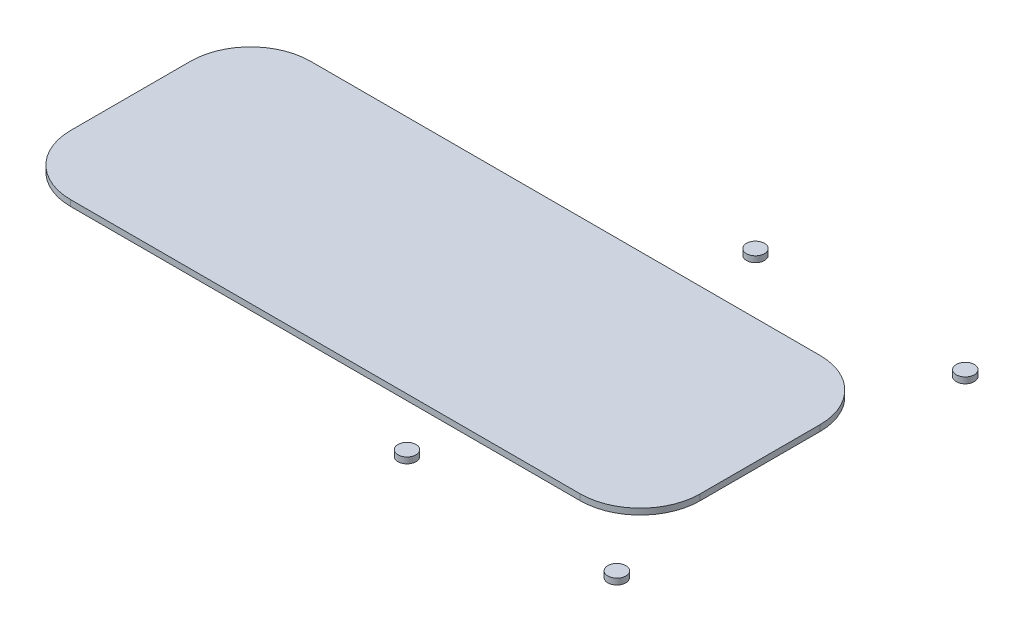
ISO-10303-21;
HEADER;
FILE_DESCRIPTION(('STEP AP214'),'2;1');
FILE_NAME('part.step','',(''),(''),'','','');
FILE_SCHEMA(('AUTOMOTIVE_DESIGN { 1 0 10303 214 1 1 1 1 }'));
ENDSEC;
DATA;
#1=APPLICATION_CONTEXT('core data for automotive mechanical design processes');
#2=APPLICATION_PROTOCOL_DEFINITION('international standard','automotive_design',2000,#1);
#3=PRODUCT_CONTEXT('',#1,'mechanical');
#4=PRODUCT('Part','Part','',(#3));
#5=PRODUCT_RELATED_PRODUCT_CATEGORY('part','',(#4));
#6=PRODUCT_DEFINITION_FORMATION('','',#4);
#7=PRODUCT_DEFINITION_CONTEXT('part definition',#1,'design');
#8=PRODUCT_DEFINITION('design','',#6,#7);
#9=PRODUCT_DEFINITION_SHAPE('','',#8);
#10=(LENGTH_UNIT() NAMED_UNIT(*) SI_UNIT(.MILLI.,.METRE.));
#11=(NAMED_UNIT(*) PLANE_ANGLE_UNIT() SI_UNIT($,.RADIAN.));
#12=(NAMED_UNIT(*) SI_UNIT($,.STERADIAN.) SOLID_ANGLE_UNIT());
#13=UNCERTAINTY_MEASURE_WITH_UNIT(LENGTH_MEASURE(1.E-05),#10,'distance_accuracy_value','');
#14=(GEOMETRIC_REPRESENTATION_CONTEXT(3) GLOBAL_UNCERTAINTY_ASSIGNED_CONTEXT((#13)) GLOBAL_UNIT_ASSIGNED_CONTEXT((#10,
#11,#12)) REPRESENTATION_CONTEXT('',''));
#15=CARTESIAN_POINT('',(0.,0.,0.));
#16=DIRECTION('',(0.,0.,1.));
#17=DIRECTION('',(1.,0.,0.));
#18=AXIS2_PLACEMENT_3D('',#15,#16,#17);
#19=CARTESIAN_POINT('',(190.917305236703,5.08,23.01875));
#20=DIRECTION('',(0.,-1.,0.));
#21=DIRECTION('',(0.,0.,-1.));
#22=AXIS2_PLACEMENT_3D('',#19,#20,#21);
#23=CYLINDRICAL_SURFACE('',#22,3.81000000000001);
#24=CARTESIAN_POINT('',(190.917305236703,5.08,23.01875));
#25=DIRECTION('',(0.,1.,0.));
#26=DIRECTION('',(0.,0.,1.));
#27=AXIS2_PLACEMENT_3D('',#24,#25,#26);
#28=CIRCLE('',#27,3.81000000000001);
#29=CARTESIAN_POINT('',(190.917305236703,5.08,26.82875));
#30=VERTEX_POINT('',#29);
#31=EDGE_CURVE('E11',#30,#30,#28,.T.);
#32=ORIENTED_EDGE('',*,*,#31,.F.);
#33=EDGE_LOOP('',(#32));
#34=FACE_BOUND('',#33,.T.);
#35=CARTESIAN_POINT('',(190.917305236703,2.54,23.01875));
#36=DIRECTION('',(0.,1.,0.));
#37=DIRECTION('',(0.,0.,1.));
#38=AXIS2_PLACEMENT_3D('',#35,#36,#37);
#39=CIRCLE('',#38,3.81000000000001);
#40=CARTESIAN_POINT('',(190.917305236703,2.54,26.82875));
#41=VERTEX_POINT('',#40);
#42=EDGE_CURVE('E42',#41,#41,#39,.T.);
#43=ORIENTED_EDGE('',*,*,#42,.T.);
#44=EDGE_LOOP('',(#43));
#45=FACE_BOUND('',#44,.T.);
#46=ADVANCED_FACE('F39',(#34,#45),#23,.T.);
#47=CARTESIAN_POINT('',(190.917305236703,5.08,23.01875));
#48=DIRECTION('',(0.,1.,0.));
#49=DIRECTION('',(0.,0.,1.));
#50=AXIS2_PLACEMENT_3D('',#47,#48,#49);
#51=PLANE('',#50);
#52=ORIENTED_EDGE('',*,*,#31,.T.);
#53=EDGE_LOOP('',(#52));
#54=FACE_BOUND('',#53,.T.);
#55=ADVANCED_FACE('F54',(#54),#51,.T.);
#56=CARTESIAN_POINT('',(190.917305236703,2.54,23.01875));
#57=DIRECTION('',(0.,1.,0.));
#58=DIRECTION('',(0.,0.,1.));
#59=AXIS2_PLACEMENT_3D('',#56,#57,#58);
#60=PLANE('',#59);
#61=ORIENTED_EDGE('',*,*,#42,.F.);
#62=EDGE_LOOP('',(#61));
#63=FACE_BOUND('',#62,.T.);
#64=ADVANCED_FACE('F52',(#63),#60,.F.);
#65=CLOSED_SHELL('',(#46,#55,#64));
#66=MANIFOLD_SOLID_BREP('B2',#65);
#67=CARTESIAN_POINT('',(279.817305236703,5.08,23.01875));
#68=DIRECTION('',(0.,-1.,0.));
#69=DIRECTION('',(0.,0.,-1.));
#70=AXIS2_PLACEMENT_3D('',#67,#68,#69);
#71=CYLINDRICAL_SURFACE('',#70,3.80999999999999);
#72=CARTESIAN_POINT('',(279.817305236703,5.08,23.01875));
#73=DIRECTION('',(0.,1.,0.));
#74=DIRECTION('',(0.,0.,1.));
#75=AXIS2_PLACEMENT_3D('',#72,#73,#74);
#76=CIRCLE('',#75,3.80999999999999);
#77=CARTESIAN_POINT('',(279.817305236703,5.08,26.82875));
#78=VERTEX_POINT('',#77);
#79=EDGE_CURVE('E38',#78,#78,#76,.T.);
#80=ORIENTED_EDGE('',*,*,#79,.F.);
#81=EDGE_LOOP('',(#80));
#82=FACE_BOUND('',#81,.T.);
#83=CARTESIAN_POINT('',(279.817305236703,2.54,23.01875));
#84=DIRECTION('',(0.,1.,0.));
#85=DIRECTION('',(0.,0.,1.));
#86=AXIS2_PLACEMENT_3D('',#83,#84,#85);
#87=CIRCLE('',#86,3.80999999999999);
#88=CARTESIAN_POINT('',(279.817305236703,2.54,26.82875));
#89=VERTEX_POINT('',#88);
#90=EDGE_CURVE('E90',#89,#89,#87,.T.);
#91=ORIENTED_EDGE('',*,*,#90,.T.);
#92=EDGE_LOOP('',(#91));
#93=FACE_BOUND('',#92,.T.);
#94=ADVANCED_FACE('F87',(#82,#93),#71,.T.);
#95=CARTESIAN_POINT('',(279.817305236703,5.08,23.01875));
#96=DIRECTION('',(0.,1.,0.));
#97=DIRECTION('',(0.,0.,1.));
#98=AXIS2_PLACEMENT_3D('',#95,#96,#97);
#99=PLANE('',#98);
#100=ORIENTED_EDGE('',*,*,#79,.T.);
#101=EDGE_LOOP('',(#100));
#102=FACE_BOUND('',#101,.T.);
#103=ADVANCED_FACE('F102',(#102),#99,.T.);
#104=CARTESIAN_POINT('',(279.817305236703,2.54,23.01875));
#105=DIRECTION('',(0.,1.,0.));
#106=DIRECTION('',(0.,0.,1.));
#107=AXIS2_PLACEMENT_3D('',#104,#105,#106);
#108=PLANE('',#107);
#109=ORIENTED_EDGE('',*,*,#90,.F.);
#110=EDGE_LOOP('',(#109));
#111=FACE_BOUND('',#110,.T.);
#112=ADVANCED_FACE('F100',(#111),#108,.F.);
#113=CLOSED_SHELL('',(#94,#103,#112));
#114=MANIFOLD_SOLID_BREP('B6',#113);
#115=CARTESIAN_POINT('',(279.817305236703,5.08,-124.61875));
#116=DIRECTION('',(0.,-1.,0.));
#117=DIRECTION('',(0.,0.,-1.));
#118=AXIS2_PLACEMENT_3D('',#115,#116,#117);
#119=CYLINDRICAL_SURFACE('',#118,3.80999999999998);
#120=CARTESIAN_POINT('',(279.817305236703,5.08,-124.61875));
#121=DIRECTION('',(0.,1.,0.));
#122=DIRECTION('',(0.,0.,1.));
#123=AXIS2_PLACEMENT_3D('',#120,#121,#122);
#124=CIRCLE('',#123,3.80999999999998);
#125=CARTESIAN_POINT('',(279.817305236703,5.08,-120.80875));
#126=VERTEX_POINT('',#125);
#127=EDGE_CURVE('E86',#126,#126,#124,.T.);
#128=ORIENTED_EDGE('',*,*,#127,.F.);
#129=EDGE_LOOP('',(#128));
#130=FACE_BOUND('',#129,.T.);
#131=CARTESIAN_POINT('',(279.817305236703,2.54,-124.61875));
#132=DIRECTION('',(0.,1.,0.));
#133=DIRECTION('',(0.,0.,1.));
#134=AXIS2_PLACEMENT_3D('',#131,#132,#133);
#135=CIRCLE('',#134,3.80999999999998);
#136=CARTESIAN_POINT('',(279.817305236703,2.54,-120.80875));
#137=VERTEX_POINT('',#136);
#138=EDGE_CURVE('E138',#137,#137,#135,.T.);
#139=ORIENTED_EDGE('',*,*,#138,.T.);
#140=EDGE_LOOP('',(#139));
#141=FACE_BOUND('',#140,.T.);
#142=ADVANCED_FACE('F135',(#130,#141),#119,.T.);
#143=CARTESIAN_POINT('',(279.817305236703,5.08,-124.61875));
#144=DIRECTION('',(0.,1.,0.));
#145=DIRECTION('',(0.,0.,1.));
#146=AXIS2_PLACEMENT_3D('',#143,#144,#145);
#147=PLANE('',#146);
#148=ORIENTED_EDGE('',*,*,#127,.T.);
#149=EDGE_LOOP('',(#148));
#150=FACE_BOUND('',#149,.T.);
#151=ADVANCED_FACE('F150',(#150),#147,.T.);
#152=CARTESIAN_POINT('',(279.817305236703,2.54,-124.61875));
#153=DIRECTION('',(0.,1.,0.));
#154=DIRECTION('',(0.,0.,1.));
#155=AXIS2_PLACEMENT_3D('',#152,#153,#154);
#156=PLANE('',#155);
#157=ORIENTED_EDGE('',*,*,#138,.F.);
#158=EDGE_LOOP('',(#157));
#159=FACE_BOUND('',#158,.T.);
#160=ADVANCED_FACE('F148',(#159),#156,.F.);
#161=CLOSED_SHELL('',(#142,#151,#160));
#162=MANIFOLD_SOLID_BREP('B33',#161);
#163=CARTESIAN_POINT('',(190.917305236703,5.08,-124.61875));
#164=DIRECTION('',(0.,-1.,0.));
#165=DIRECTION('',(0.,0.,-1.));
#166=AXIS2_PLACEMENT_3D('',#163,#164,#165);
#167=CYLINDRICAL_SURFACE('',#166,3.81000000000002);
#168=CARTESIAN_POINT('',(190.917305236703,5.08,-124.61875));
#169=DIRECTION('',(0.,1.,0.));
#170=DIRECTION('',(0.,0.,1.));
#171=AXIS2_PLACEMENT_3D('',#168,#169,#170);
#172=CIRCLE('',#171,3.81000000000002);
#173=CARTESIAN_POINT('',(190.917305236703,5.08,-120.80875));
#174=VERTEX_POINT('',#173);
#175=EDGE_CURVE('E134',#174,#174,#172,.T.);
#176=ORIENTED_EDGE('',*,*,#175,.F.);
#177=EDGE_LOOP('',(#176));
#178=FACE_BOUND('',#177,.T.);
#179=CARTESIAN_POINT('',(190.917305236703,2.54,-124.61875));
#180=DIRECTION('',(0.,1.,0.));
#181=DIRECTION('',(0.,0.,1.));
#182=AXIS2_PLACEMENT_3D('',#179,#180,#181);
#183=CIRCLE('',#182,3.81000000000002);
#184=CARTESIAN_POINT('',(190.917305236703,2.54,-120.80875));
#185=VERTEX_POINT('',#184);
#186=EDGE_CURVE('E187',#185,#185,#183,.T.);
#187=ORIENTED_EDGE('',*,*,#186,.T.);
#188=EDGE_LOOP('',(#187));
#189=FACE_BOUND('',#188,.T.);
#190=ADVANCED_FACE('F184',(#178,#189),#167,.T.);
#191=CARTESIAN_POINT('',(190.917305236703,5.08,-124.61875));
#192=DIRECTION('',(0.,1.,0.));
#193=DIRECTION('',(0.,0.,1.));
#194=AXIS2_PLACEMENT_3D('',#191,#192,#193);
#195=PLANE('',#194);
#196=ORIENTED_EDGE('',*,*,#175,.T.);
#197=EDGE_LOOP('',(#196));
#198=FACE_BOUND('',#197,.T.);
#199=ADVANCED_FACE('F199',(#198),#195,.T.);
#200=CARTESIAN_POINT('',(190.917305236703,2.54,-124.61875));
#201=DIRECTION('',(0.,1.,0.));
#202=DIRECTION('',(0.,0.,1.));
#203=AXIS2_PLACEMENT_3D('',#200,#201,#202);
#204=PLANE('',#203);
#205=ORIENTED_EDGE('',*,*,#186,.F.);
#206=EDGE_LOOP('',(#205));
#207=FACE_BOUND('',#206,.T.);
#208=ADVANCED_FACE('F197',(#207),#204,.F.);
#209=CLOSED_SHELL('',(#190,#199,#208));
#210=MANIFOLD_SOLID_BREP('B81',#209);
#211=CARTESIAN_POINT('',(0.,2.54,0.));
#212=DIRECTION('',(1.,0.,0.));
#213=DIRECTION('',(0.,0.,-1.));
#214=AXIS2_PLACEMENT_3D('',#211,#212,#213);
#215=PLANE('',#214);
#216=DIRECTION('',(0.,0.,1.));
#217=VECTOR('',#216,1.);
#218=CARTESIAN_POINT('',(0.,2.54,0.));
#219=LINE('',#218,#217);
#220=CARTESIAN_POINT('',(0.,2.54,-76.2));
#221=VERTEX_POINT('',#220);
#222=CARTESIAN_POINT('',(0.,2.54,-25.4));
#223=VERTEX_POINT('',#222);
#224=EDGE_CURVE('E310',#221,#223,#219,.T.);
#225=ORIENTED_EDGE('',*,*,#224,.F.);
#226=DIRECTION('',(0.,-1.,0.));
#227=VECTOR('',#226,1.);
#228=CARTESIAN_POINT('',(0.,2.54,-76.2));
#229=LINE('',#228,#227);
#230=CARTESIAN_POINT('',(0.,0.,-76.2));
#231=VERTEX_POINT('',#230);
#232=EDGE_CURVE('E295',#221,#231,#229,.T.);
#233=ORIENTED_EDGE('',*,*,#232,.T.);
#234=DIRECTION('',(0.,0.,1.));
#235=VECTOR('',#234,1.);
#236=CARTESIAN_POINT('',(0.,0.,0.));
#237=LINE('',#236,#235);
#238=CARTESIAN_POINT('',(0.,0.,-25.4));
#239=VERTEX_POINT('',#238);
#240=EDGE_CURVE('E307',#231,#239,#237,.T.);
#241=ORIENTED_EDGE('',*,*,#240,.T.);
#242=DIRECTION('',(0.,-1.,0.));
#243=VECTOR('',#242,1.);
#244=CARTESIAN_POINT('',(0.,2.54,-25.4));
#245=LINE('',#244,#243);
#246=EDGE_CURVE('E312',#239,#223,#245,.F.);
#247=ORIENTED_EDGE('',*,*,#246,.T.);
#248=EDGE_LOOP('',(#225,#233,#241,#247));
#249=FACE_BOUND('',#248,.T.);
#250=ADVANCED_FACE('F225',(#249),#215,.F.);
#251=CARTESIAN_POINT('',(0.,2.54,0.));
#252=DIRECTION('',(0.,0.,-1.));
#253=DIRECTION('',(-1.,0.,0.));
#254=AXIS2_PLACEMENT_3D('',#251,#252,#253);
#255=PLANE('',#254);
#256=DIRECTION('',(1.,0.,0.));
#257=VECTOR('',#256,1.);
#258=CARTESIAN_POINT('',(0.,2.54,0.));
#259=LINE('',#258,#257);
#260=CARTESIAN_POINT('',(25.4,2.54,0.));
#261=VERTEX_POINT('',#260);
#262=CARTESIAN_POINT('',(241.3,2.54,0.));
#263=VERTEX_POINT('',#262);
#264=EDGE_CURVE('E352',#261,#263,#259,.T.);
#265=ORIENTED_EDGE('',*,*,#264,.F.);
#266=DIRECTION('',(0.,-1.,0.));
#267=VECTOR('',#266,1.);
#268=CARTESIAN_POINT('',(25.4,2.54,0.));
#269=LINE('',#268,#267);
#270=CARTESIAN_POINT('',(25.4,0.,0.));
#271=VERTEX_POINT('',#270);
#272=EDGE_CURVE('E345',#261,#271,#269,.T.);
#273=ORIENTED_EDGE('',*,*,#272,.T.);
#274=DIRECTION('',(1.,0.,0.));
#275=VECTOR('',#274,1.);
#276=CARTESIAN_POINT('',(0.,0.,0.));
#277=LINE('',#276,#275);
#278=CARTESIAN_POINT('',(241.3,0.,0.));
#279=VERTEX_POINT('',#278);
#280=EDGE_CURVE('E316',#271,#279,#277,.T.);
#281=ORIENTED_EDGE('',*,*,#280,.T.);
#282=DIRECTION('',(0.,-1.,0.));
#283=VECTOR('',#282,1.);
#284=CARTESIAN_POINT('',(241.3,2.54,0.));
#285=LINE('',#284,#283);
#286=EDGE_CURVE('E343',#279,#263,#285,.F.);
#287=ORIENTED_EDGE('',*,*,#286,.T.);
#288=EDGE_LOOP('',(#265,#273,#281,#287));
#289=FACE_BOUND('',#288,.T.);
#290=ADVANCED_FACE('F350',(#289),#255,.F.);
#291=CARTESIAN_POINT('',(266.7,2.54,0.));
#292=DIRECTION('',(-1.,0.,0.));
#293=DIRECTION('',(0.,0.,1.));
#294=AXIS2_PLACEMENT_3D('',#291,#292,#293);
#295=PLANE('',#294);
#296=DIRECTION('',(0.,0.,-1.));
#297=VECTOR('',#296,1.);
#298=CARTESIAN_POINT('',(266.7,2.54,0.));
#299=LINE('',#298,#297);
#300=CARTESIAN_POINT('',(266.7,2.54,-25.4));
#301=VERTEX_POINT('',#300);
#302=CARTESIAN_POINT('',(266.7,2.54,-76.2));
#303=VERTEX_POINT('',#302);
#304=EDGE_CURVE('E360',#301,#303,#299,.T.);
#305=ORIENTED_EDGE('',*,*,#304,.F.);
#306=DIRECTION('',(0.,-1.,0.));
#307=VECTOR('',#306,1.);
#308=CARTESIAN_POINT('',(266.7,2.54,-25.4));
#309=LINE('',#308,#307);
#310=CARTESIAN_POINT('',(266.7,0.,-25.4));
#311=VERTEX_POINT('',#310);
#312=EDGE_CURVE('E182',#301,#311,#309,.T.);
#313=ORIENTED_EDGE('',*,*,#312,.T.);
#314=DIRECTION('',(0.,0.,-1.));
#315=VECTOR('',#314,1.);
#316=CARTESIAN_POINT('',(266.7,0.,0.));
#317=LINE('',#316,#315);
#318=CARTESIAN_POINT('',(266.7,0.,-76.2));
#319=VERTEX_POINT('',#318);
#320=EDGE_CURVE('E319',#311,#319,#317,.T.);
#321=ORIENTED_EDGE('',*,*,#320,.T.);
#322=DIRECTION('',(0.,-1.,0.));
#323=VECTOR('',#322,1.);
#324=CARTESIAN_POINT('',(266.7,2.54,-76.2));
#325=LINE('',#324,#323);
#326=EDGE_CURVE('E233',#319,#303,#325,.F.);
#327=ORIENTED_EDGE('',*,*,#326,.T.);
#328=EDGE_LOOP('',(#305,#313,#321,#327));
#329=FACE_BOUND('',#328,.T.);
#330=ADVANCED_FACE('F359',(#329),#295,.F.);
#331=CARTESIAN_POINT('',(0.,2.54,-101.6));
#332=DIRECTION('',(0.,0.,1.));
#333=DIRECTION('',(1.,0.,0.));
#334=AXIS2_PLACEMENT_3D('',#331,#332,#333);
#335=PLANE('',#334);
#336=DIRECTION('',(-1.,0.,0.));
#337=VECTOR('',#336,1.);
#338=CARTESIAN_POINT('',(0.,0.,-101.6));
#339=LINE('',#338,#337);
#340=CARTESIAN_POINT('',(241.3,0.,-101.6));
#341=VERTEX_POINT('',#340);
#342=CARTESIAN_POINT('',(25.4,0.,-101.6));
#343=VERTEX_POINT('',#342);
#344=EDGE_CURVE('E326',#341,#343,#339,.T.);
#345=ORIENTED_EDGE('',*,*,#344,.T.);
#346=DIRECTION('',(0.,-1.,0.));
#347=VECTOR('',#346,1.);
#348=CARTESIAN_POINT('',(25.4,2.54,-101.6));
#349=LINE('',#348,#347);
#350=CARTESIAN_POINT('',(25.4,2.54,-101.6));
#351=VERTEX_POINT('',#350);
#352=EDGE_CURVE('E296',#343,#351,#349,.F.);
#353=ORIENTED_EDGE('',*,*,#352,.T.);
#354=DIRECTION('',(-1.,0.,0.));
#355=VECTOR('',#354,1.);
#356=CARTESIAN_POINT('',(0.,2.54,-101.6));
#357=LINE('',#356,#355);
#358=CARTESIAN_POINT('',(241.3,2.54,-101.6));
#359=VERTEX_POINT('',#358);
#360=EDGE_CURVE('E322',#359,#351,#357,.T.);
#361=ORIENTED_EDGE('',*,*,#360,.F.);
#362=DIRECTION('',(0.,-1.,0.));
#363=VECTOR('',#362,1.);
#364=CARTESIAN_POINT('',(241.3,2.54,-101.6));
#365=LINE('',#364,#363);
#366=EDGE_CURVE('E301',#359,#341,#365,.T.);
#367=ORIENTED_EDGE('',*,*,#366,.T.);
#368=EDGE_LOOP('',(#345,#353,#361,#367));
#369=FACE_BOUND('',#368,.T.);
#370=ADVANCED_FACE('F383',(#369),#335,.F.);
#371=CARTESIAN_POINT('',(0.,2.54,0.));
#372=DIRECTION('',(0.,-1.,0.));
#373=DIRECTION('',(0.,0.,-1.));
#374=AXIS2_PLACEMENT_3D('',#371,#372,#373);
#375=PLANE('',#374);
#376=ORIENTED_EDGE('',*,*,#360,.T.);
#377=CARTESIAN_POINT('',(25.4,2.54,-76.2));
#378=DIRECTION('',(0.,-1.,0.));
#379=DIRECTION('',(0.,0.,-1.));
#380=AXIS2_PLACEMENT_3D('',#377,#378,#379);
#381=CIRCLE('',#380,25.4);
#382=EDGE_CURVE('E341',#351,#221,#381,.F.);
#383=ORIENTED_EDGE('',*,*,#382,.T.);
#384=ORIENTED_EDGE('',*,*,#224,.T.);
#385=CARTESIAN_POINT('',(25.4,2.54,-25.4));
#386=DIRECTION('',(0.,-1.,0.));
#387=DIRECTION('',(0.,0.,-1.));
#388=AXIS2_PLACEMENT_3D('',#385,#386,#387);
#389=CIRCLE('',#388,25.4);
#390=EDGE_CURVE('E339',#223,#261,#389,.F.);
#391=ORIENTED_EDGE('',*,*,#390,.T.);
#392=ORIENTED_EDGE('',*,*,#264,.T.);
#393=CARTESIAN_POINT('',(241.3,2.54,-25.4));
#394=DIRECTION('',(0.,-1.,0.));
#395=DIRECTION('',(0.,0.,-1.));
#396=AXIS2_PLACEMENT_3D('',#393,#394,#395);
#397=CIRCLE('',#396,25.4);
#398=EDGE_CURVE('E246',#263,#301,#397,.F.);
#399=ORIENTED_EDGE('',*,*,#398,.T.);
#400=ORIENTED_EDGE('',*,*,#304,.T.);
#401=CARTESIAN_POINT('',(241.3,2.54,-76.2));
#402=DIRECTION('',(0.,-1.,0.));
#403=DIRECTION('',(0.,0.,-1.));
#404=AXIS2_PLACEMENT_3D('',#401,#402,#403);
#405=CIRCLE('',#404,25.4);
#406=EDGE_CURVE('E336',#303,#359,#405,.F.);
#407=ORIENTED_EDGE('',*,*,#406,.T.);
#408=EDGE_LOOP('',(#376,#383,#384,#391,#392,#399,#400,#407));
#409=FACE_BOUND('',#408,.T.);
#410=ADVANCED_FACE('F365',(#409),#375,.F.);
#411=CARTESIAN_POINT('',(0.,0.,0.));
#412=DIRECTION('',(0.,-1.,0.));
#413=DIRECTION('',(0.,0.,-1.));
#414=AXIS2_PLACEMENT_3D('',#411,#412,#413);
#415=PLANE('',#414);
#416=ORIENTED_EDGE('',*,*,#240,.F.);
#417=CARTESIAN_POINT('',(25.4,0.,-76.2));
#418=DIRECTION('',(0.,-1.,0.));
#419=DIRECTION('',(0.,0.,-1.));
#420=AXIS2_PLACEMENT_3D('',#417,#418,#419);
#421=CIRCLE('',#420,25.4);
#422=EDGE_CURVE('E291',#231,#343,#421,.T.);
#423=ORIENTED_EDGE('',*,*,#422,.T.);
#424=ORIENTED_EDGE('',*,*,#344,.F.);
#425=CARTESIAN_POINT('',(241.3,0.,-76.2));
#426=DIRECTION('',(0.,-1.,0.));
#427=DIRECTION('',(0.,0.,-1.));
#428=AXIS2_PLACEMENT_3D('',#425,#426,#427);
#429=CIRCLE('',#428,25.4);
#430=EDGE_CURVE('E311',#341,#319,#429,.T.);
#431=ORIENTED_EDGE('',*,*,#430,.T.);
#432=ORIENTED_EDGE('',*,*,#320,.F.);
#433=CARTESIAN_POINT('',(241.3,0.,-25.4));
#434=DIRECTION('',(0.,-1.,0.));
#435=DIRECTION('',(0.,0.,-1.));
#436=AXIS2_PLACEMENT_3D('',#433,#434,#435);
#437=CIRCLE('',#436,25.4);
#438=EDGE_CURVE('E330',#311,#279,#437,.T.);
#439=ORIENTED_EDGE('',*,*,#438,.T.);
#440=ORIENTED_EDGE('',*,*,#280,.F.);
#441=CARTESIAN_POINT('',(25.4,0.,-25.4));
#442=DIRECTION('',(0.,-1.,0.));
#443=DIRECTION('',(0.,0.,-1.));
#444=AXIS2_PLACEMENT_3D('',#441,#442,#443);
#445=CIRCLE('',#444,25.4);
#446=EDGE_CURVE('E302',#271,#239,#445,.T.);
#447=ORIENTED_EDGE('',*,*,#446,.T.);
#448=EDGE_LOOP('',(#416,#423,#424,#431,#432,#439,#440,#447));
#449=FACE_BOUND('',#448,.T.);
#450=ADVANCED_FACE('F314',(#449),#415,.T.);
#451=CARTESIAN_POINT('',(25.4,2.54,-76.2));
#452=DIRECTION('',(0.,-1.,0.));
#453=DIRECTION('',(0.,0.,-1.));
#454=AXIS2_PLACEMENT_3D('',#451,#452,#453);
#455=CYLINDRICAL_SURFACE('',#454,25.4);
#456=ORIENTED_EDGE('',*,*,#382,.F.);
#457=ORIENTED_EDGE('',*,*,#352,.F.);
#458=ORIENTED_EDGE('',*,*,#422,.F.);
#459=ORIENTED_EDGE('',*,*,#232,.F.);
#460=EDGE_LOOP('',(#456,#457,#458,#459));
#461=FACE_BOUND('',#460,.T.);
#462=ADVANCED_FACE('F294',(#461),#455,.T.);
#463=CARTESIAN_POINT('',(25.4,2.54,-25.4));
#464=DIRECTION('',(0.,-1.,0.));
#465=DIRECTION('',(0.,0.,-1.));
#466=AXIS2_PLACEMENT_3D('',#463,#464,#465);
#467=CYLINDRICAL_SURFACE('',#466,25.4);
#468=ORIENTED_EDGE('',*,*,#390,.F.);
#469=ORIENTED_EDGE('',*,*,#246,.F.);
#470=ORIENTED_EDGE('',*,*,#446,.F.);
#471=ORIENTED_EDGE('',*,*,#272,.F.);
#472=EDGE_LOOP('',(#468,#469,#470,#471));
#473=FACE_BOUND('',#472,.T.);
#474=ADVANCED_FACE('F366',(#473),#467,.T.);
#475=CARTESIAN_POINT('',(241.3,2.54,-25.4));
#476=DIRECTION('',(0.,-1.,0.));
#477=DIRECTION('',(0.,0.,-1.));
#478=AXIS2_PLACEMENT_3D('',#475,#476,#477);
#479=CYLINDRICAL_SURFACE('',#478,25.4);
#480=ORIENTED_EDGE('',*,*,#398,.F.);
#481=ORIENTED_EDGE('',*,*,#286,.F.);
#482=ORIENTED_EDGE('',*,*,#438,.F.);
#483=ORIENTED_EDGE('',*,*,#312,.F.);
#484=EDGE_LOOP('',(#480,#481,#482,#483));
#485=FACE_BOUND('',#484,.T.);
#486=ADVANCED_FACE('F358',(#485),#479,.T.);
#487=CARTESIAN_POINT('',(241.3,2.54,-76.2));
#488=DIRECTION('',(0.,-1.,0.));
#489=DIRECTION('',(0.,0.,-1.));
#490=AXIS2_PLACEMENT_3D('',#487,#488,#489);
#491=CYLINDRICAL_SURFACE('',#490,25.4);
#492=ORIENTED_EDGE('',*,*,#406,.F.);
#493=ORIENTED_EDGE('',*,*,#326,.F.);
#494=ORIENTED_EDGE('',*,*,#430,.F.);
#495=ORIENTED_EDGE('',*,*,#366,.F.);
#496=EDGE_LOOP('',(#492,#493,#494,#495));
#497=FACE_BOUND('',#496,.T.);
#498=ADVANCED_FACE('F227',(#497),#491,.T.);
#499=CLOSED_SHELL('',(#250,#290,#330,#370,#410,#450,#462,#474,#486,#498));
#500=MANIFOLD_SOLID_BREP('B129',#499);
#501=ADVANCED_BREP_SHAPE_REPRESENTATION('',(#18,#66,#114,#162,#210,#500),#14);
#502=SHAPE_DEFINITION_REPRESENTATION(#9,#501);
ENDSEC;
END-ISO-10303-21;
